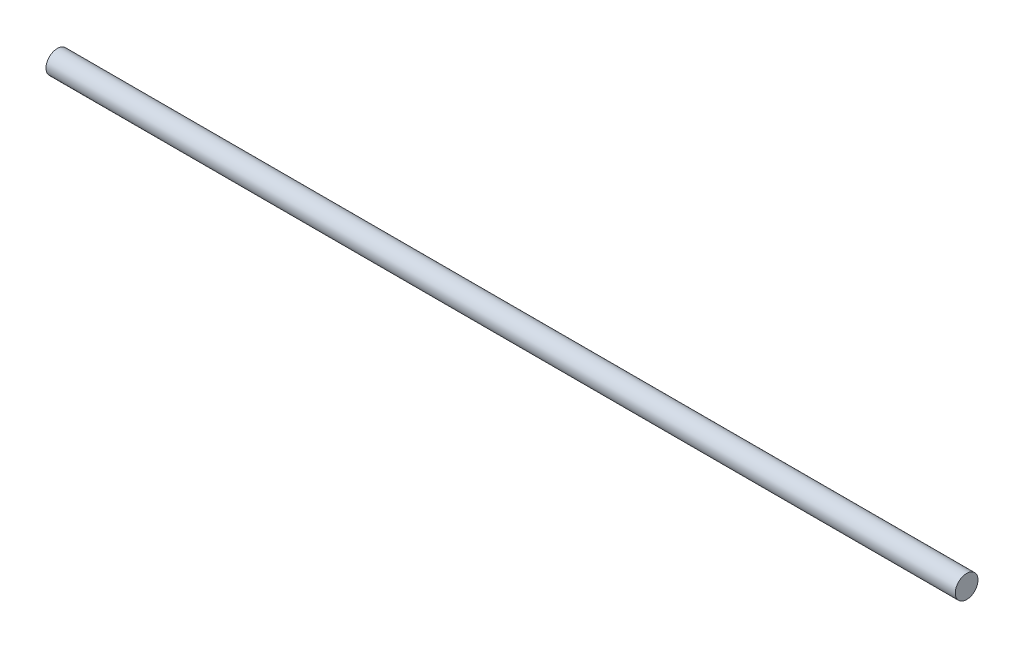
ISO-10303-21;
HEADER;
FILE_DESCRIPTION(('STEP AP214'),'2;1');
FILE_NAME('part.step','',(''),(''),'','','');
FILE_SCHEMA(('AUTOMOTIVE_DESIGN { 1 0 10303 214 1 1 1 1 }'));
ENDSEC;
DATA;
#1=APPLICATION_CONTEXT('core data for automotive mechanical design processes');
#2=APPLICATION_PROTOCOL_DEFINITION('international standard','automotive_design',2000,#1);
#3=PRODUCT_CONTEXT('',#1,'mechanical');
#4=PRODUCT('Part','Part','',(#3));
#5=PRODUCT_RELATED_PRODUCT_CATEGORY('part','',(#4));
#6=PRODUCT_DEFINITION_FORMATION('','',#4);
#7=PRODUCT_DEFINITION_CONTEXT('part definition',#1,'design');
#8=PRODUCT_DEFINITION('design','',#6,#7);
#9=PRODUCT_DEFINITION_SHAPE('','',#8);
#10=(LENGTH_UNIT() NAMED_UNIT(*) SI_UNIT(.MILLI.,.METRE.));
#11=(NAMED_UNIT(*) PLANE_ANGLE_UNIT() SI_UNIT($,.RADIAN.));
#12=(NAMED_UNIT(*) SI_UNIT($,.STERADIAN.) SOLID_ANGLE_UNIT());
#13=UNCERTAINTY_MEASURE_WITH_UNIT(LENGTH_MEASURE(1.E-05),#10,'distance_accuracy_value','');
#14=(GEOMETRIC_REPRESENTATION_CONTEXT(3) GLOBAL_UNCERTAINTY_ASSIGNED_CONTEXT((#13)) GLOBAL_UNIT_ASSIGNED_CONTEXT((#10,
#11,#12)) REPRESENTATION_CONTEXT('',''));
#15=CARTESIAN_POINT('',(0.,0.,0.));
#16=DIRECTION('',(0.,0.,1.));
#17=DIRECTION('',(1.,0.,0.));
#18=AXIS2_PLACEMENT_3D('',#15,#16,#17);
#19=CARTESIAN_POINT('',(50.,0.,0.));
#20=DIRECTION('',(-1.,0.,0.));
#21=DIRECTION('',(0.,0.,1.));
#22=AXIS2_PLACEMENT_3D('',#19,#20,#21);
#23=CYLINDRICAL_SURFACE('',#22,1.25);
#24=CARTESIAN_POINT('',(50.,0.,0.));
#25=DIRECTION('',(1.,0.,0.));
#26=DIRECTION('',(0.,0.,-1.));
#27=AXIS2_PLACEMENT_3D('',#24,#25,#26);
#28=CIRCLE('',#27,1.25);
#29=CARTESIAN_POINT('',(50.,0.,-1.25));
#30=VERTEX_POINT('',#29);
#31=EDGE_CURVE('E10',#30,#30,#28,.T.);
#32=ORIENTED_EDGE('',*,*,#31,.F.);
#33=EDGE_LOOP('',(#32));
#34=FACE_BOUND('',#33,.T.);
#35=CARTESIAN_POINT('',(-50.,0.,0.));
#36=DIRECTION('',(1.,0.,0.));
#37=DIRECTION('',(0.,0.,-1.));
#38=AXIS2_PLACEMENT_3D('',#35,#36,#37);
#39=CIRCLE('',#38,1.25);
#40=CARTESIAN_POINT('',(-50.,0.,-1.25));
#41=VERTEX_POINT('',#40);
#42=EDGE_CURVE('E34',#41,#41,#39,.T.);
#43=ORIENTED_EDGE('',*,*,#42,.T.);
#44=EDGE_LOOP('',(#43));
#45=FACE_BOUND('',#44,.T.);
#46=ADVANCED_FACE('F31',(#34,#45),#23,.T.);
#47=CARTESIAN_POINT('',(50.,0.,0.));
#48=DIRECTION('',(1.,0.,0.));
#49=DIRECTION('',(0.,0.,-1.));
#50=AXIS2_PLACEMENT_3D('',#47,#48,#49);
#51=PLANE('',#50);
#52=ORIENTED_EDGE('',*,*,#31,.T.);
#53=EDGE_LOOP('',(#52));
#54=FACE_BOUND('',#53,.T.);
#55=ADVANCED_FACE('F46',(#54),#51,.T.);
#56=CARTESIAN_POINT('',(-50.,0.,0.));
#57=DIRECTION('',(1.,0.,0.));
#58=DIRECTION('',(0.,0.,-1.));
#59=AXIS2_PLACEMENT_3D('',#56,#57,#58);
#60=PLANE('',#59);
#61=ORIENTED_EDGE('',*,*,#42,.F.);
#62=EDGE_LOOP('',(#61));
#63=FACE_BOUND('',#62,.T.);
#64=ADVANCED_FACE('F44',(#63),#60,.F.);
#65=CLOSED_SHELL('',(#46,#55,#64));
#66=MANIFOLD_SOLID_BREP('B2',#65);
#67=ADVANCED_BREP_SHAPE_REPRESENTATION('',(#18,#66),#14);
#68=SHAPE_DEFINITION_REPRESENTATION(#9,#67);
ENDSEC;
END-ISO-10303-21;
